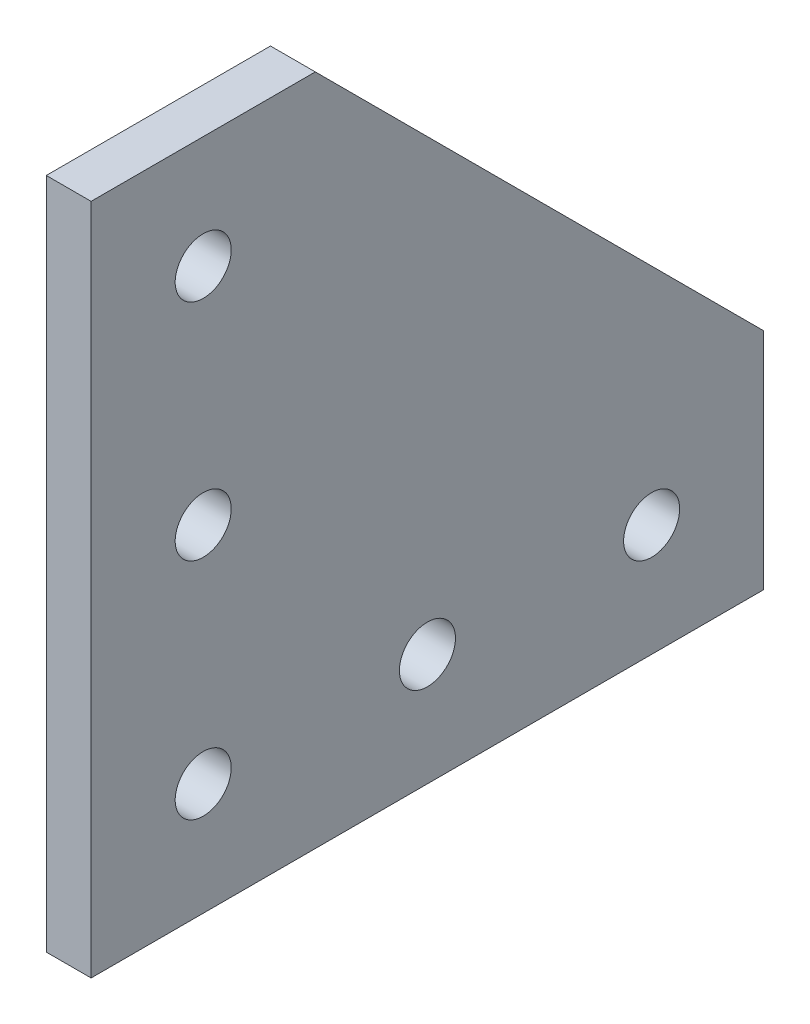
ISO-10303-21;
HEADER;
FILE_DESCRIPTION(('STEP AP214'),'2;1');
FILE_NAME('part.step','',(''),(''),'','','');
FILE_SCHEMA(('AUTOMOTIVE_DESIGN { 1 0 10303 214 1 1 1 1 }'));
ENDSEC;
DATA;
#1=APPLICATION_CONTEXT('core data for automotive mechanical design processes');
#2=APPLICATION_PROTOCOL_DEFINITION('international standard','automotive_design',2000,#1);
#3=PRODUCT_CONTEXT('',#1,'mechanical');
#4=PRODUCT('Part','Part','',(#3));
#5=PRODUCT_RELATED_PRODUCT_CATEGORY('part','',(#4));
#6=PRODUCT_DEFINITION_FORMATION('','',#4);
#7=PRODUCT_DEFINITION_CONTEXT('part definition',#1,'design');
#8=PRODUCT_DEFINITION('design','',#6,#7);
#9=PRODUCT_DEFINITION_SHAPE('','',#8);
#10=(LENGTH_UNIT() NAMED_UNIT(*) SI_UNIT(.MILLI.,.METRE.));
#11=(NAMED_UNIT(*) PLANE_ANGLE_UNIT() SI_UNIT($,.RADIAN.));
#12=(NAMED_UNIT(*) SI_UNIT($,.STERADIAN.) SOLID_ANGLE_UNIT());
#13=UNCERTAINTY_MEASURE_WITH_UNIT(LENGTH_MEASURE(1.E-05),#10,'distance_accuracy_value','');
#14=(GEOMETRIC_REPRESENTATION_CONTEXT(3) GLOBAL_UNCERTAINTY_ASSIGNED_CONTEXT((#13)) GLOBAL_UNIT_ASSIGNED_CONTEXT((#10,
#11,#12)) REPRESENTATION_CONTEXT('',''));
#15=CARTESIAN_POINT('',(0.,0.,0.));
#16=DIRECTION('',(0.,0.,1.));
#17=DIRECTION('',(1.,0.,0.));
#18=AXIS2_PLACEMENT_3D('',#15,#16,#17);
#19=CARTESIAN_POINT('',(4.,0.,0.));
#20=DIRECTION('',(-1.,0.,0.));
#21=DIRECTION('',(0.,0.,1.));
#22=AXIS2_PLACEMENT_3D('',#19,#20,#21);
#23=PLANE('',#22);
#24=DIRECTION('',(0.,0.,-1.));
#25=VECTOR('',#24,1.);
#26=CARTESIAN_POINT('',(4.,0.,-60.));
#27=LINE('',#26,#25);
#28=CARTESIAN_POINT('',(4.,0.,0.));
#29=VERTEX_POINT('',#28);
#30=CARTESIAN_POINT('',(4.,0.,-60.));
#31=VERTEX_POINT('',#30);
#32=EDGE_CURVE('E139',#29,#31,#27,.T.);
#33=ORIENTED_EDGE('',*,*,#32,.T.);
#34=DIRECTION('',(0.,1.,0.));
#35=VECTOR('',#34,1.);
#36=CARTESIAN_POINT('',(4.,20.,-60.));
#37=LINE('',#36,#35);
#38=CARTESIAN_POINT('',(4.,20.,-60.));
#39=VERTEX_POINT('',#38);
#40=EDGE_CURVE('E97',#31,#39,#37,.T.);
#41=ORIENTED_EDGE('',*,*,#40,.T.);
#42=DIRECTION('',(0.,0.707106781186548,0.707106781186548));
#43=VECTOR('',#42,1.);
#44=CARTESIAN_POINT('',(4.,60.,-20.));
#45=LINE('',#44,#43);
#46=CARTESIAN_POINT('',(4.,60.,-20.));
#47=VERTEX_POINT('',#46);
#48=EDGE_CURVE('E101',#39,#47,#45,.T.);
#49=ORIENTED_EDGE('',*,*,#48,.T.);
#50=DIRECTION('',(0.,0.,1.));
#51=VECTOR('',#50,1.);
#52=CARTESIAN_POINT('',(4.,60.,0.));
#53=LINE('',#52,#51);
#54=CARTESIAN_POINT('',(4.,60.,0.));
#55=VERTEX_POINT('',#54);
#56=EDGE_CURVE('E105',#47,#55,#53,.T.);
#57=ORIENTED_EDGE('',*,*,#56,.T.);
#58=DIRECTION('',(0.,-1.,0.));
#59=VECTOR('',#58,1.);
#60=CARTESIAN_POINT('',(4.,0.,0.));
#61=LINE('',#60,#59);
#62=EDGE_CURVE('E63',#55,#29,#61,.T.);
#63=ORIENTED_EDGE('',*,*,#62,.T.);
#64=EDGE_LOOP('',(#33,#41,#49,#57,#63));
#65=FACE_BOUND('',#64,.T.);
#66=CARTESIAN_POINT('',(4.,9.99999999999999,-10.));
#67=DIRECTION('',(1.,0.,0.));
#68=DIRECTION('',(0.,0.,-1.));
#69=AXIS2_PLACEMENT_3D('',#66,#67,#68);
#70=CIRCLE('',#69,2.5);
#71=CARTESIAN_POINT('',(4.,9.99999999999999,-12.5));
#72=VERTEX_POINT('',#71);
#73=EDGE_CURVE('E130',#72,#72,#70,.T.);
#74=ORIENTED_EDGE('',*,*,#73,.F.);
#75=EDGE_LOOP('',(#74));
#76=FACE_BOUND('',#75,.T.);
#77=CARTESIAN_POINT('',(4.,9.99999999999999,-29.999999878));
#78=DIRECTION('',(1.,0.,0.));
#79=DIRECTION('',(0.,0.,-1.));
#80=AXIS2_PLACEMENT_3D('',#77,#78,#79);
#81=CIRCLE('',#80,2.5);
#82=CARTESIAN_POINT('',(4.,9.99999999999999,-32.499999878));
#83=VERTEX_POINT('',#82);
#84=EDGE_CURVE('E217',#83,#83,#81,.T.);
#85=ORIENTED_EDGE('',*,*,#84,.F.);
#86=EDGE_LOOP('',(#85));
#87=FACE_BOUND('',#86,.T.);
#88=CARTESIAN_POINT('',(4.,30.,-10.));
#89=DIRECTION('',(1.,0.,0.));
#90=DIRECTION('',(0.,0.,-1.));
#91=AXIS2_PLACEMENT_3D('',#88,#89,#90);
#92=CIRCLE('',#91,2.5);
#93=CARTESIAN_POINT('',(4.,30.,-12.5));
#94=VERTEX_POINT('',#93);
#95=EDGE_CURVE('E209',#94,#94,#92,.T.);
#96=ORIENTED_EDGE('',*,*,#95,.F.);
#97=EDGE_LOOP('',(#96));
#98=FACE_BOUND('',#97,.T.);
#99=CARTESIAN_POINT('',(4.,50.,-10.));
#100=DIRECTION('',(1.,0.,0.));
#101=DIRECTION('',(0.,0.,-1.));
#102=AXIS2_PLACEMENT_3D('',#99,#100,#101);
#103=CIRCLE('',#102,2.5);
#104=CARTESIAN_POINT('',(4.,50.,-12.5));
#105=VERTEX_POINT('',#104);
#106=EDGE_CURVE('E201',#105,#105,#103,.T.);
#107=ORIENTED_EDGE('',*,*,#106,.F.);
#108=EDGE_LOOP('',(#107));
#109=FACE_BOUND('',#108,.T.);
#110=CARTESIAN_POINT('',(4.,9.99999999999999,-49.999999756));
#111=DIRECTION('',(1.,0.,0.));
#112=DIRECTION('',(0.,0.,-1.));
#113=AXIS2_PLACEMENT_3D('',#110,#111,#112);
#114=CIRCLE('',#113,2.5);
#115=CARTESIAN_POINT('',(4.,9.99999999999999,-52.499999756));
#116=VERTEX_POINT('',#115);
#117=EDGE_CURVE('E190',#116,#116,#114,.T.);
#118=ORIENTED_EDGE('',*,*,#117,.F.);
#119=EDGE_LOOP('',(#118));
#120=FACE_BOUND('',#119,.T.);
#121=ADVANCED_FACE('F45',(#65,#76,#87,#98,#109,#120),#23,.F.);
#122=CARTESIAN_POINT('',(0.,0.,0.));
#123=DIRECTION('',(-1.,0.,0.));
#124=DIRECTION('',(0.,0.,1.));
#125=AXIS2_PLACEMENT_3D('',#122,#123,#124);
#126=PLANE('',#125);
#127=CARTESIAN_POINT('',(0.,50.,-10.));
#128=DIRECTION('',(1.,0.,0.));
#129=DIRECTION('',(0.,0.,-1.));
#130=AXIS2_PLACEMENT_3D('',#127,#128,#129);
#131=CIRCLE('',#130,2.5);
#132=CARTESIAN_POINT('',(0.,50.,-12.5));
#133=VERTEX_POINT('',#132);
#134=EDGE_CURVE('E198',#133,#133,#131,.T.);
#135=ORIENTED_EDGE('',*,*,#134,.T.);
#136=EDGE_LOOP('',(#135));
#137=FACE_BOUND('',#136,.T.);
#138=CARTESIAN_POINT('',(0.,9.99999999999999,-29.999999878));
#139=DIRECTION('',(1.,0.,0.));
#140=DIRECTION('',(0.,0.,-1.));
#141=AXIS2_PLACEMENT_3D('',#138,#139,#140);
#142=CIRCLE('',#141,2.5);
#143=CARTESIAN_POINT('',(0.,9.99999999999999,-32.499999878));
#144=VERTEX_POINT('',#143);
#145=EDGE_CURVE('E213',#144,#144,#142,.T.);
#146=ORIENTED_EDGE('',*,*,#145,.T.);
#147=EDGE_LOOP('',(#146));
#148=FACE_BOUND('',#147,.T.);
#149=DIRECTION('',(0.,0.,-1.));
#150=VECTOR('',#149,1.);
#151=CARTESIAN_POINT('',(0.,0.,-60.));
#152=LINE('',#151,#150);
#153=CARTESIAN_POINT('',(0.,0.,0.));
#154=VERTEX_POINT('',#153);
#155=CARTESIAN_POINT('',(0.,0.,-60.));
#156=VERTEX_POINT('',#155);
#157=EDGE_CURVE('E125',#154,#156,#152,.T.);
#158=ORIENTED_EDGE('',*,*,#157,.F.);
#159=DIRECTION('',(0.,-1.,0.));
#160=VECTOR('',#159,1.);
#161=CARTESIAN_POINT('',(0.,0.,0.));
#162=LINE('',#161,#160);
#163=CARTESIAN_POINT('',(0.,60.,0.));
#164=VERTEX_POINT('',#163);
#165=EDGE_CURVE('E89',#164,#154,#162,.T.);
#166=ORIENTED_EDGE('',*,*,#165,.F.);
#167=DIRECTION('',(0.,0.,1.));
#168=VECTOR('',#167,1.);
#169=CARTESIAN_POINT('',(0.,60.,0.));
#170=LINE('',#169,#168);
#171=CARTESIAN_POINT('',(0.,60.,-20.));
#172=VERTEX_POINT('',#171);
#173=EDGE_CURVE('E83',#172,#164,#170,.T.);
#174=ORIENTED_EDGE('',*,*,#173,.F.);
#175=DIRECTION('',(0.,0.707106781186548,0.707106781186548));
#176=VECTOR('',#175,1.);
#177=CARTESIAN_POINT('',(0.,60.,-20.));
#178=LINE('',#177,#176);
#179=CARTESIAN_POINT('',(0.,20.,-60.));
#180=VERTEX_POINT('',#179);
#181=EDGE_CURVE('E113',#180,#172,#178,.T.);
#182=ORIENTED_EDGE('',*,*,#181,.F.);
#183=DIRECTION('',(0.,1.,0.));
#184=VECTOR('',#183,1.);
#185=CARTESIAN_POINT('',(0.,20.,-60.));
#186=LINE('',#185,#184);
#187=EDGE_CURVE('E129',#156,#180,#186,.T.);
#188=ORIENTED_EDGE('',*,*,#187,.F.);
#189=EDGE_LOOP('',(#158,#166,#174,#182,#188));
#190=FACE_BOUND('',#189,.T.);
#191=CARTESIAN_POINT('',(0.,9.99999999999999,-10.));
#192=DIRECTION('',(1.,0.,0.));
#193=DIRECTION('',(0.,0.,-1.));
#194=AXIS2_PLACEMENT_3D('',#191,#192,#193);
#195=CIRCLE('',#194,2.5);
#196=CARTESIAN_POINT('',(0.,9.99999999999999,-12.5));
#197=VERTEX_POINT('',#196);
#198=EDGE_CURVE('E221',#197,#197,#195,.T.);
#199=ORIENTED_EDGE('',*,*,#198,.T.);
#200=EDGE_LOOP('',(#199));
#201=FACE_BOUND('',#200,.T.);
#202=CARTESIAN_POINT('',(0.,30.,-10.));
#203=DIRECTION('',(1.,0.,0.));
#204=DIRECTION('',(0.,0.,-1.));
#205=AXIS2_PLACEMENT_3D('',#202,#203,#204);
#206=CIRCLE('',#205,2.5);
#207=CARTESIAN_POINT('',(0.,30.,-12.5));
#208=VERTEX_POINT('',#207);
#209=EDGE_CURVE('E205',#208,#208,#206,.T.);
#210=ORIENTED_EDGE('',*,*,#209,.T.);
#211=EDGE_LOOP('',(#210));
#212=FACE_BOUND('',#211,.T.);
#213=CARTESIAN_POINT('',(0.,9.99999999999999,-49.999999756));
#214=DIRECTION('',(1.,0.,0.));
#215=DIRECTION('',(0.,0.,-1.));
#216=AXIS2_PLACEMENT_3D('',#213,#214,#215);
#217=CIRCLE('',#216,2.5);
#218=CARTESIAN_POINT('',(0.,9.99999999999999,-52.499999756));
#219=VERTEX_POINT('',#218);
#220=EDGE_CURVE('E193',#219,#219,#217,.T.);
#221=ORIENTED_EDGE('',*,*,#220,.T.);
#222=EDGE_LOOP('',(#221));
#223=FACE_BOUND('',#222,.T.);
#224=ADVANCED_FACE('F146',(#137,#148,#190,#201,#212,#223),#126,.T.);
#225=CARTESIAN_POINT('',(4.,0.,-60.));
#226=DIRECTION('',(0.,1.,0.));
#227=DIRECTION('',(0.,0.,1.));
#228=AXIS2_PLACEMENT_3D('',#225,#226,#227);
#229=PLANE('',#228);
#230=ORIENTED_EDGE('',*,*,#157,.T.);
#231=DIRECTION('',(-1.,0.,0.));
#232=VECTOR('',#231,1.);
#233=CARTESIAN_POINT('',(4.,0.,-60.));
#234=LINE('',#233,#232);
#235=EDGE_CURVE('E11',#31,#156,#234,.T.);
#236=ORIENTED_EDGE('',*,*,#235,.F.);
#237=ORIENTED_EDGE('',*,*,#32,.F.);
#238=DIRECTION('',(-1.,0.,0.));
#239=VECTOR('',#238,1.);
#240=CARTESIAN_POINT('',(4.,0.,0.));
#241=LINE('',#240,#239);
#242=EDGE_CURVE('E121',#29,#154,#241,.T.);
#243=ORIENTED_EDGE('',*,*,#242,.T.);
#244=EDGE_LOOP('',(#230,#236,#237,#243));
#245=FACE_BOUND('',#244,.T.);
#246=ADVANCED_FACE('F47',(#245),#229,.F.);
#247=CARTESIAN_POINT('',(4.,20.,-60.));
#248=DIRECTION('',(0.,0.,1.));
#249=DIRECTION('',(1.,0.,0.));
#250=AXIS2_PLACEMENT_3D('',#247,#248,#249);
#251=PLANE('',#250);
#252=ORIENTED_EDGE('',*,*,#187,.T.);
#253=DIRECTION('',(-1.,0.,0.));
#254=VECTOR('',#253,1.);
#255=CARTESIAN_POINT('',(4.,20.,-60.));
#256=LINE('',#255,#254);
#257=EDGE_CURVE('E55',#39,#180,#256,.T.);
#258=ORIENTED_EDGE('',*,*,#257,.F.);
#259=ORIENTED_EDGE('',*,*,#40,.F.);
#260=ORIENTED_EDGE('',*,*,#235,.T.);
#261=EDGE_LOOP('',(#252,#258,#259,#260));
#262=FACE_BOUND('',#261,.T.);
#263=ADVANCED_FACE('F291',(#262),#251,.F.);
#264=CARTESIAN_POINT('',(4.,60.,-20.));
#265=DIRECTION('',(0.,-0.707106781186547,0.707106781186547));
#266=DIRECTION('',(0.,-0.707106781186548,-0.707106781186548));
#267=AXIS2_PLACEMENT_3D('',#264,#265,#266);
#268=PLANE('',#267);
#269=ORIENTED_EDGE('',*,*,#181,.T.);
#270=DIRECTION('',(-1.,0.,0.));
#271=VECTOR('',#270,1.);
#272=CARTESIAN_POINT('',(4.,60.,-20.));
#273=LINE('',#272,#271);
#274=EDGE_CURVE('E110',#47,#172,#273,.T.);
#275=ORIENTED_EDGE('',*,*,#274,.F.);
#276=ORIENTED_EDGE('',*,*,#48,.F.);
#277=ORIENTED_EDGE('',*,*,#257,.T.);
#278=EDGE_LOOP('',(#269,#275,#276,#277));
#279=FACE_BOUND('',#278,.T.);
#280=ADVANCED_FACE('F111',(#279),#268,.F.);
#281=CARTESIAN_POINT('',(4.,60.,0.));
#282=DIRECTION('',(0.,-1.,0.));
#283=DIRECTION('',(0.,0.,-1.));
#284=AXIS2_PLACEMENT_3D('',#281,#282,#283);
#285=PLANE('',#284);
#286=ORIENTED_EDGE('',*,*,#173,.T.);
#287=DIRECTION('',(-1.,0.,0.));
#288=VECTOR('',#287,1.);
#289=CARTESIAN_POINT('',(4.,60.,0.));
#290=LINE('',#289,#288);
#291=EDGE_CURVE('E115',#55,#164,#290,.T.);
#292=ORIENTED_EDGE('',*,*,#291,.F.);
#293=ORIENTED_EDGE('',*,*,#56,.F.);
#294=ORIENTED_EDGE('',*,*,#274,.T.);
#295=EDGE_LOOP('',(#286,#292,#293,#294));
#296=FACE_BOUND('',#295,.T.);
#297=ADVANCED_FACE('F117',(#296),#285,.F.);
#298=CARTESIAN_POINT('',(4.,0.,0.));
#299=DIRECTION('',(0.,0.,-1.));
#300=DIRECTION('',(-1.,0.,0.));
#301=AXIS2_PLACEMENT_3D('',#298,#299,#300);
#302=PLANE('',#301);
#303=ORIENTED_EDGE('',*,*,#165,.T.);
#304=ORIENTED_EDGE('',*,*,#242,.F.);
#305=ORIENTED_EDGE('',*,*,#62,.F.);
#306=ORIENTED_EDGE('',*,*,#291,.T.);
#307=EDGE_LOOP('',(#303,#304,#305,#306));
#308=FACE_BOUND('',#307,.T.);
#309=ADVANCED_FACE('F151',(#308),#302,.F.);
#310=CARTESIAN_POINT('',(4.,9.99999999999999,-10.));
#311=DIRECTION('',(-1.,0.,0.));
#312=DIRECTION('',(0.,0.,1.));
#313=AXIS2_PLACEMENT_3D('',#310,#311,#312);
#314=CYLINDRICAL_SURFACE('',#313,2.5);
#315=ORIENTED_EDGE('',*,*,#73,.T.);
#316=EDGE_LOOP('',(#315));
#317=FACE_BOUND('',#316,.T.);
#318=ORIENTED_EDGE('',*,*,#198,.F.);
#319=EDGE_LOOP('',(#318));
#320=FACE_BOUND('',#319,.T.);
#321=ADVANCED_FACE('F153',(#317,#320),#314,.F.);
#322=CARTESIAN_POINT('',(4.,9.99999999999999,-29.999999878));
#323=DIRECTION('',(-1.,0.,0.));
#324=DIRECTION('',(0.,0.,1.));
#325=AXIS2_PLACEMENT_3D('',#322,#323,#324);
#326=CYLINDRICAL_SURFACE('',#325,2.5);
#327=ORIENTED_EDGE('',*,*,#84,.T.);
#328=EDGE_LOOP('',(#327));
#329=FACE_BOUND('',#328,.T.);
#330=ORIENTED_EDGE('',*,*,#145,.F.);
#331=EDGE_LOOP('',(#330));
#332=FACE_BOUND('',#331,.T.);
#333=ADVANCED_FACE('F159',(#329,#332),#326,.F.);
#334=CARTESIAN_POINT('',(4.,30.,-10.));
#335=DIRECTION('',(-1.,0.,0.));
#336=DIRECTION('',(0.,0.,1.));
#337=AXIS2_PLACEMENT_3D('',#334,#335,#336);
#338=CYLINDRICAL_SURFACE('',#337,2.5);
#339=ORIENTED_EDGE('',*,*,#95,.T.);
#340=EDGE_LOOP('',(#339));
#341=FACE_BOUND('',#340,.T.);
#342=ORIENTED_EDGE('',*,*,#209,.F.);
#343=EDGE_LOOP('',(#342));
#344=FACE_BOUND('',#343,.T.);
#345=ADVANCED_FACE('F173',(#341,#344),#338,.F.);
#346=CARTESIAN_POINT('',(4.,50.,-10.));
#347=DIRECTION('',(-1.,0.,0.));
#348=DIRECTION('',(0.,0.,1.));
#349=AXIS2_PLACEMENT_3D('',#346,#347,#348);
#350=CYLINDRICAL_SURFACE('',#349,2.5);
#351=ORIENTED_EDGE('',*,*,#106,.T.);
#352=EDGE_LOOP('',(#351));
#353=FACE_BOUND('',#352,.T.);
#354=ORIENTED_EDGE('',*,*,#134,.F.);
#355=EDGE_LOOP('',(#354));
#356=FACE_BOUND('',#355,.T.);
#357=ADVANCED_FACE('F177',(#353,#356),#350,.F.);
#358=CARTESIAN_POINT('',(4.,9.99999999999999,-49.999999756));
#359=DIRECTION('',(-1.,0.,0.));
#360=DIRECTION('',(0.,0.,1.));
#361=AXIS2_PLACEMENT_3D('',#358,#359,#360);
#362=CYLINDRICAL_SURFACE('',#361,2.5);
#363=ORIENTED_EDGE('',*,*,#117,.T.);
#364=EDGE_LOOP('',(#363));
#365=FACE_BOUND('',#364,.T.);
#366=ORIENTED_EDGE('',*,*,#220,.F.);
#367=EDGE_LOOP('',(#366));
#368=FACE_BOUND('',#367,.T.);
#369=ADVANCED_FACE('F181',(#365,#368),#362,.F.);
#370=CLOSED_SHELL('',(#121,#224,#246,#263,#280,#297,#309,#321,#333,#345,#357,#369));
#371=MANIFOLD_SOLID_BREP('B2',#370);
#372=ADVANCED_BREP_SHAPE_REPRESENTATION('',(#18,#371),#14);
#373=SHAPE_DEFINITION_REPRESENTATION(#9,#372);
ENDSEC;
END-ISO-10303-21;
